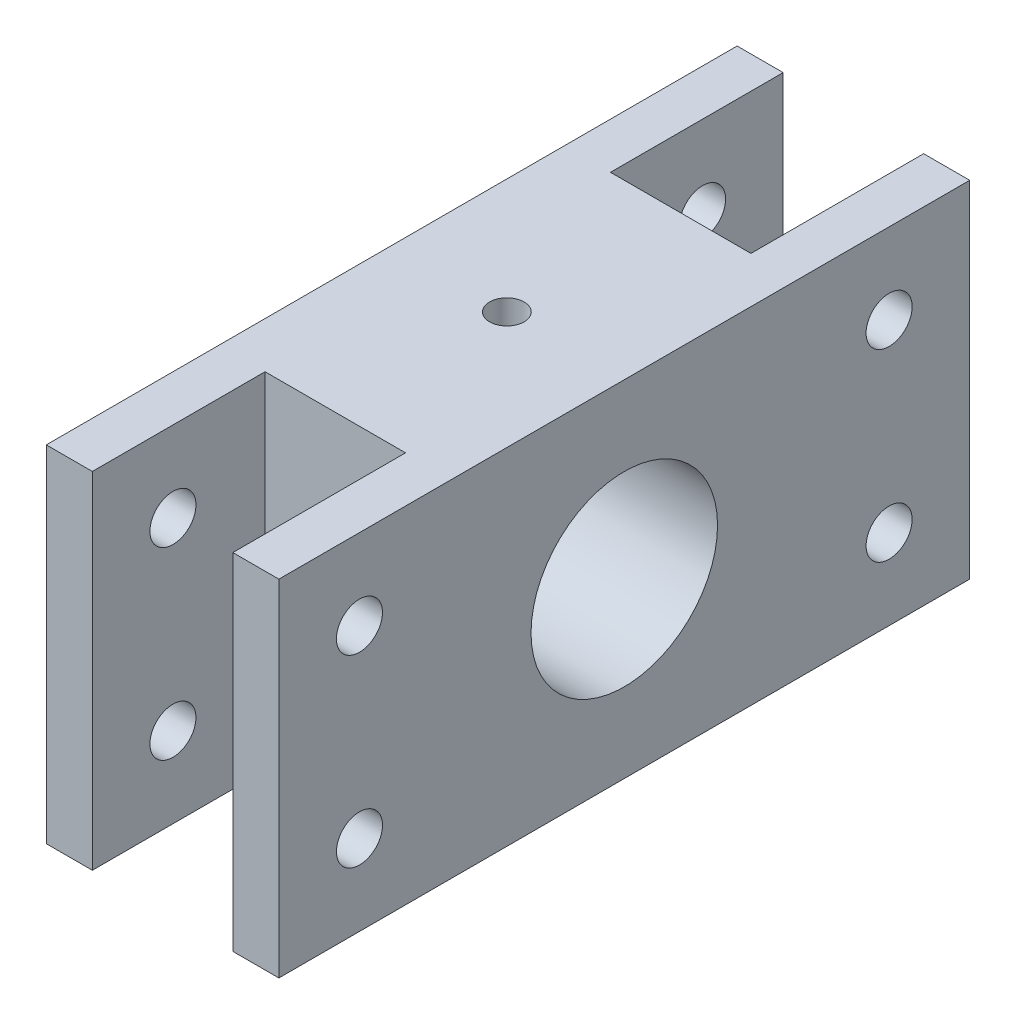
ISO-10303-21;
HEADER;
FILE_DESCRIPTION(('STEP AP214'),'2;1');
FILE_NAME('part.step','',(''),(''),'','','');
FILE_SCHEMA(('AUTOMOTIVE_DESIGN { 1 0 10303 214 1 1 1 1 }'));
ENDSEC;
DATA;
#1=APPLICATION_CONTEXT('core data for automotive mechanical design processes');
#2=APPLICATION_PROTOCOL_DEFINITION('international standard','automotive_design',2000,#1);
#3=PRODUCT_CONTEXT('',#1,'mechanical');
#4=PRODUCT('Part','Part','',(#3));
#5=PRODUCT_RELATED_PRODUCT_CATEGORY('part','',(#4));
#6=PRODUCT_DEFINITION_FORMATION('','',#4);
#7=PRODUCT_DEFINITION_CONTEXT('part definition',#1,'design');
#8=PRODUCT_DEFINITION('design','',#6,#7);
#9=PRODUCT_DEFINITION_SHAPE('','',#8);
#10=(LENGTH_UNIT() NAMED_UNIT(*) SI_UNIT(.MILLI.,.METRE.));
#11=(NAMED_UNIT(*) PLANE_ANGLE_UNIT() SI_UNIT($,.RADIAN.));
#12=(NAMED_UNIT(*) SI_UNIT($,.STERADIAN.) SOLID_ANGLE_UNIT());
#13=UNCERTAINTY_MEASURE_WITH_UNIT(LENGTH_MEASURE(1.E-05),#10,'distance_accuracy_value','');
#14=(GEOMETRIC_REPRESENTATION_CONTEXT(3) GLOBAL_UNCERTAINTY_ASSIGNED_CONTEXT((#13)) GLOBAL_UNIT_ASSIGNED_CONTEXT((#10,
#11,#12)) REPRESENTATION_CONTEXT('',''));
#15=CARTESIAN_POINT('',(0.,0.,0.));
#16=DIRECTION('',(0.,0.,1.));
#17=DIRECTION('',(1.,0.,0.));
#18=AXIS2_PLACEMENT_3D('',#15,#16,#17);
#19=CARTESIAN_POINT('',(20.2,15.,-30.));
#20=DIRECTION('',(0.,0.,1.));
#21=DIRECTION('',(0.,-1.,0.));
#22=AXIS2_PLACEMENT_3D('',#19,#20,#21);
#23=PLANE('',#22);
#24=DIRECTION('',(-1.,0.,0.));
#25=VECTOR('',#24,1.);
#26=CARTESIAN_POINT('',(20.2,-15.,-30.));
#27=LINE('',#26,#25);
#28=CARTESIAN_POINT('',(20.2,-15.,-30.));
#29=VERTEX_POINT('',#28);
#30=CARTESIAN_POINT('',(16.2,-15.,-30.));
#31=VERTEX_POINT('',#30);
#32=EDGE_CURVE('E149',#29,#31,#27,.T.);
#33=ORIENTED_EDGE('',*,*,#32,.T.);
#34=DIRECTION('',(0.,1.,0.));
#35=VECTOR('',#34,1.);
#36=CARTESIAN_POINT('',(16.2,-15.,-30.));
#37=LINE('',#36,#35);
#38=CARTESIAN_POINT('',(16.2,15.,-30.));
#39=VERTEX_POINT('',#38);
#40=EDGE_CURVE('E170',#31,#39,#37,.T.);
#41=ORIENTED_EDGE('',*,*,#40,.T.);
#42=DIRECTION('',(-1.,0.,0.));
#43=VECTOR('',#42,1.);
#44=CARTESIAN_POINT('',(20.2,15.,-30.));
#45=LINE('',#44,#43);
#46=CARTESIAN_POINT('',(20.2,15.,-30.));
#47=VERTEX_POINT('',#46);
#48=EDGE_CURVE('E11',#47,#39,#45,.T.);
#49=ORIENTED_EDGE('',*,*,#48,.F.);
#50=DIRECTION('',(0.,1.,0.));
#51=VECTOR('',#50,1.);
#52=CARTESIAN_POINT('',(20.2,15.,-30.));
#53=LINE('',#52,#51);
#54=EDGE_CURVE('E312',#29,#47,#53,.T.);
#55=ORIENTED_EDGE('',*,*,#54,.F.);
#56=EDGE_LOOP('',(#33,#41,#49,#55));
#57=FACE_BOUND('',#56,.T.);
#58=ADVANCED_FACE('F32',(#57),#23,.F.);
#59=CARTESIAN_POINT('',(20.2,15.,30.));
#60=DIRECTION('',(0.,0.,-1.));
#61=DIRECTION('',(0.,1.,0.));
#62=AXIS2_PLACEMENT_3D('',#59,#60,#61);
#63=PLANE('',#62);
#64=DIRECTION('',(-1.,0.,0.));
#65=VECTOR('',#64,1.);
#66=CARTESIAN_POINT('',(20.2,-15.,30.));
#67=LINE('',#66,#65);
#68=CARTESIAN_POINT('',(4.00000000000002,-15.,30.));
#69=VERTEX_POINT('',#68);
#70=CARTESIAN_POINT('',(0.,-15.,30.));
#71=VERTEX_POINT('',#70);
#72=EDGE_CURVE('E153',#69,#71,#67,.T.);
#73=ORIENTED_EDGE('',*,*,#72,.F.);
#74=DIRECTION('',(0.,1.,0.));
#75=VECTOR('',#74,1.);
#76=CARTESIAN_POINT('',(4.00000000000002,-15.,30.));
#77=LINE('',#76,#75);
#78=CARTESIAN_POINT('',(4.00000000000002,15.,30.));
#79=VERTEX_POINT('',#78);
#80=EDGE_CURVE('E270',#69,#79,#77,.T.);
#81=ORIENTED_EDGE('',*,*,#80,.T.);
#82=DIRECTION('',(-1.,0.,0.));
#83=VECTOR('',#82,1.);
#84=CARTESIAN_POINT('',(20.2,15.,30.));
#85=LINE('',#84,#83);
#86=CARTESIAN_POINT('',(0.,15.,30.));
#87=VERTEX_POINT('',#86);
#88=EDGE_CURVE('E162',#79,#87,#85,.T.);
#89=ORIENTED_EDGE('',*,*,#88,.T.);
#90=DIRECTION('',(0.,-1.,0.));
#91=VECTOR('',#90,1.);
#92=CARTESIAN_POINT('',(0.,15.,30.));
#93=LINE('',#92,#91);
#94=EDGE_CURVE('E319',#87,#71,#93,.T.);
#95=ORIENTED_EDGE('',*,*,#94,.T.);
#96=EDGE_LOOP('',(#73,#81,#89,#95));
#97=FACE_BOUND('',#96,.T.);
#98=ADVANCED_FACE('F204',(#97),#63,.F.);
#99=CARTESIAN_POINT('',(20.2,8.,23.));
#100=DIRECTION('',(-1.,0.,0.));
#101=DIRECTION('',(0.,0.,1.));
#102=AXIS2_PLACEMENT_3D('',#99,#100,#101);
#103=CYLINDRICAL_SURFACE('',#102,2.);
#104=CARTESIAN_POINT('',(4.00000000000001,8.,23.));
#105=DIRECTION('',(-1.,0.,0.));
#106=DIRECTION('',(0.,0.,1.));
#107=AXIS2_PLACEMENT_3D('',#104,#105,#106);
#108=CIRCLE('',#107,2.);
#109=CARTESIAN_POINT('',(4.00000000000002,8.,25.));
#110=VERTEX_POINT('',#109);
#111=EDGE_CURVE('E181',#110,#110,#108,.T.);
#112=ORIENTED_EDGE('',*,*,#111,.F.);
#113=EDGE_LOOP('',(#112));
#114=FACE_BOUND('',#113,.T.);
#115=CARTESIAN_POINT('',(0.,8.,23.));
#116=DIRECTION('',(1.,0.,0.));
#117=DIRECTION('',(0.,0.,-1.));
#118=AXIS2_PLACEMENT_3D('',#115,#116,#117);
#119=CIRCLE('',#118,2.);
#120=CARTESIAN_POINT('',(0.,8.,21.));
#121=VERTEX_POINT('',#120);
#122=EDGE_CURVE('E303',#121,#121,#119,.T.);
#123=ORIENTED_EDGE('',*,*,#122,.F.);
#124=EDGE_LOOP('',(#123));
#125=FACE_BOUND('',#124,.T.);
#126=ADVANCED_FACE('F209',(#114,#125),#103,.F.);
#127=CARTESIAN_POINT('',(20.2,-8.,23.));
#128=DIRECTION('',(-1.,0.,0.));
#129=DIRECTION('',(0.,0.,1.));
#130=AXIS2_PLACEMENT_3D('',#127,#128,#129);
#131=CYLINDRICAL_SURFACE('',#130,2.);
#132=CARTESIAN_POINT('',(4.00000000000001,-8.,23.));
#133=DIRECTION('',(-1.,0.,0.));
#134=DIRECTION('',(0.,0.,1.));
#135=AXIS2_PLACEMENT_3D('',#132,#133,#134);
#136=CIRCLE('',#135,2.);
#137=CARTESIAN_POINT('',(4.00000000000002,-8.,25.));
#138=VERTEX_POINT('',#137);
#139=EDGE_CURVE('E179',#138,#138,#136,.T.);
#140=ORIENTED_EDGE('',*,*,#139,.F.);
#141=EDGE_LOOP('',(#140));
#142=FACE_BOUND('',#141,.T.);
#143=CARTESIAN_POINT('',(0.,-8.,23.));
#144=DIRECTION('',(1.,0.,0.));
#145=DIRECTION('',(0.,0.,1.));
#146=AXIS2_PLACEMENT_3D('',#143,#144,#145);
#147=CIRCLE('',#146,2.);
#148=CARTESIAN_POINT('',(0.,-8.,25.));
#149=VERTEX_POINT('',#148);
#150=EDGE_CURVE('E297',#149,#149,#147,.T.);
#151=ORIENTED_EDGE('',*,*,#150,.F.);
#152=EDGE_LOOP('',(#151));
#153=FACE_BOUND('',#152,.T.);
#154=ADVANCED_FACE('F389',(#142,#153),#131,.F.);
#155=CARTESIAN_POINT('',(20.2,-8.,-23.));
#156=DIRECTION('',(-1.,0.,0.));
#157=DIRECTION('',(0.,0.,1.));
#158=AXIS2_PLACEMENT_3D('',#155,#156,#157);
#159=CYLINDRICAL_SURFACE('',#158,2.);
#160=CARTESIAN_POINT('',(16.2,-8.,-23.));
#161=DIRECTION('',(1.,0.,0.));
#162=DIRECTION('',(0.,0.,-1.));
#163=AXIS2_PLACEMENT_3D('',#160,#161,#162);
#164=CIRCLE('',#163,2.);
#165=CARTESIAN_POINT('',(16.2,-8.,-25.));
#166=VERTEX_POINT('',#165);
#167=EDGE_CURVE('E174',#166,#166,#164,.T.);
#168=ORIENTED_EDGE('',*,*,#167,.F.);
#169=EDGE_LOOP('',(#168));
#170=FACE_BOUND('',#169,.T.);
#171=CARTESIAN_POINT('',(20.2,-8.,-23.));
#172=DIRECTION('',(1.,0.,0.));
#173=DIRECTION('',(0.,0.,-1.));
#174=AXIS2_PLACEMENT_3D('',#171,#172,#173);
#175=CIRCLE('',#174,2.);
#176=CARTESIAN_POINT('',(20.2,-8.,-25.));
#177=VERTEX_POINT('',#176);
#178=EDGE_CURVE('E294',#177,#177,#175,.T.);
#179=ORIENTED_EDGE('',*,*,#178,.T.);
#180=EDGE_LOOP('',(#179));
#181=FACE_BOUND('',#180,.T.);
#182=ADVANCED_FACE('F386',(#170,#181),#159,.F.);
#183=CARTESIAN_POINT('',(20.2,8.,-23.));
#184=DIRECTION('',(-1.,0.,0.));
#185=DIRECTION('',(0.,0.,1.));
#186=AXIS2_PLACEMENT_3D('',#183,#184,#185);
#187=CYLINDRICAL_SURFACE('',#186,2.);
#188=CARTESIAN_POINT('',(16.2,8.,-23.));
#189=DIRECTION('',(1.,0.,0.));
#190=DIRECTION('',(0.,0.,-1.));
#191=AXIS2_PLACEMENT_3D('',#188,#189,#190);
#192=CIRCLE('',#191,2.);
#193=CARTESIAN_POINT('',(16.2,8.,-25.));
#194=VERTEX_POINT('',#193);
#195=EDGE_CURVE('E171',#194,#194,#192,.T.);
#196=ORIENTED_EDGE('',*,*,#195,.F.);
#197=EDGE_LOOP('',(#196));
#198=FACE_BOUND('',#197,.T.);
#199=CARTESIAN_POINT('',(20.2,8.,-23.));
#200=DIRECTION('',(1.,0.,0.));
#201=DIRECTION('',(0.,0.,1.));
#202=AXIS2_PLACEMENT_3D('',#199,#200,#201);
#203=CIRCLE('',#202,2.);
#204=CARTESIAN_POINT('',(20.2,8.,-21.));
#205=VERTEX_POINT('',#204);
#206=EDGE_CURVE('E288',#205,#205,#203,.T.);
#207=ORIENTED_EDGE('',*,*,#206,.T.);
#208=EDGE_LOOP('',(#207));
#209=FACE_BOUND('',#208,.T.);
#210=ADVANCED_FACE('F227',(#198,#209),#187,.F.);
#211=CARTESIAN_POINT('',(20.2,0.,0.));
#212=DIRECTION('',(1.,0.,0.));
#213=DIRECTION('',(0.,0.,-1.));
#214=AXIS2_PLACEMENT_3D('',#211,#212,#213);
#215=PLANE('',#214);
#216=CARTESIAN_POINT('',(20.2,0.,0.));
#217=DIRECTION('',(-1.,0.,0.));
#218=DIRECTION('',(0.,0.,1.));
#219=AXIS2_PLACEMENT_3D('',#216,#217,#218);
#220=CIRCLE('',#219,8.1);
#221=CARTESIAN_POINT('',(20.2,0.,8.1));
#222=VERTEX_POINT('',#221);
#223=EDGE_CURVE('E257',#222,#222,#220,.T.);
#224=ORIENTED_EDGE('',*,*,#223,.T.);
#225=EDGE_LOOP('',(#224));
#226=FACE_BOUND('',#225,.T.);
#227=ORIENTED_EDGE('',*,*,#178,.F.);
#228=EDGE_LOOP('',(#227));
#229=FACE_BOUND('',#228,.T.);
#230=CARTESIAN_POINT('',(20.2,8.,23.));
#231=DIRECTION('',(1.,0.,0.));
#232=DIRECTION('',(0.,0.,-1.));
#233=AXIS2_PLACEMENT_3D('',#230,#231,#232);
#234=CIRCLE('',#233,2.);
#235=CARTESIAN_POINT('',(20.2,8.,21.));
#236=VERTEX_POINT('',#235);
#237=EDGE_CURVE('E306',#236,#236,#234,.T.);
#238=ORIENTED_EDGE('',*,*,#237,.F.);
#239=EDGE_LOOP('',(#238));
#240=FACE_BOUND('',#239,.T.);
#241=ORIENTED_EDGE('',*,*,#54,.T.);
#242=DIRECTION('',(0.,0.,1.));
#243=VECTOR('',#242,1.);
#244=CARTESIAN_POINT('',(20.2,15.,30.));
#245=LINE('',#244,#243);
#246=CARTESIAN_POINT('',(20.2,15.,30.));
#247=VERTEX_POINT('',#246);
#248=EDGE_CURVE('E248',#47,#247,#245,.T.);
#249=ORIENTED_EDGE('',*,*,#248,.T.);
#250=DIRECTION('',(0.,-1.,0.));
#251=VECTOR('',#250,1.);
#252=CARTESIAN_POINT('',(20.2,15.,30.));
#253=LINE('',#252,#251);
#254=CARTESIAN_POINT('',(20.2,-15.,30.));
#255=VERTEX_POINT('',#254);
#256=EDGE_CURVE('E154',#247,#255,#253,.T.);
#257=ORIENTED_EDGE('',*,*,#256,.T.);
#258=DIRECTION('',(0.,0.,-1.));
#259=VECTOR('',#258,1.);
#260=CARTESIAN_POINT('',(20.2,-15.,30.));
#261=LINE('',#260,#259);
#262=EDGE_CURVE('E150',#255,#29,#261,.T.);
#263=ORIENTED_EDGE('',*,*,#262,.T.);
#264=EDGE_LOOP('',(#241,#249,#257,#263));
#265=FACE_BOUND('',#264,.T.);
#266=CARTESIAN_POINT('',(20.2,-8.,23.));
#267=DIRECTION('',(1.,0.,0.));
#268=DIRECTION('',(0.,0.,1.));
#269=AXIS2_PLACEMENT_3D('',#266,#267,#268);
#270=CIRCLE('',#269,2.);
#271=CARTESIAN_POINT('',(20.2,-8.,25.));
#272=VERTEX_POINT('',#271);
#273=EDGE_CURVE('E300',#272,#272,#270,.T.);
#274=ORIENTED_EDGE('',*,*,#273,.F.);
#275=EDGE_LOOP('',(#274));
#276=FACE_BOUND('',#275,.T.);
#277=ORIENTED_EDGE('',*,*,#206,.F.);
#278=EDGE_LOOP('',(#277));
#279=FACE_BOUND('',#278,.T.);
#280=ADVANCED_FACE('F221',(#226,#229,#240,#265,#276,#279),#215,.T.);
#281=CARTESIAN_POINT('',(0.,0.,0.));
#282=DIRECTION('',(1.,0.,0.));
#283=DIRECTION('',(0.,0.,-1.));
#284=AXIS2_PLACEMENT_3D('',#281,#282,#283);
#285=PLANE('',#284);
#286=CARTESIAN_POINT('',(0.,0.,0.));
#287=DIRECTION('',(-1.,0.,0.));
#288=DIRECTION('',(0.,0.,1.));
#289=AXIS2_PLACEMENT_3D('',#286,#287,#288);
#290=CIRCLE('',#289,8.1);
#291=CARTESIAN_POINT('',(0.,0.,8.1));
#292=VERTEX_POINT('',#291);
#293=EDGE_CURVE('E262',#292,#292,#290,.T.);
#294=ORIENTED_EDGE('',*,*,#293,.F.);
#295=EDGE_LOOP('',(#294));
#296=FACE_BOUND('',#295,.T.);
#297=DIRECTION('',(0.,1.,0.));
#298=VECTOR('',#297,1.);
#299=CARTESIAN_POINT('',(0.,15.,-30.));
#300=LINE('',#299,#298);
#301=CARTESIAN_POINT('',(0.,-15.,-30.));
#302=VERTEX_POINT('',#301);
#303=CARTESIAN_POINT('',(0.,15.,-30.));
#304=VERTEX_POINT('',#303);
#305=EDGE_CURVE('E309',#302,#304,#300,.T.);
#306=ORIENTED_EDGE('',*,*,#305,.F.);
#307=DIRECTION('',(0.,0.,-1.));
#308=VECTOR('',#307,1.);
#309=CARTESIAN_POINT('',(0.,-15.,30.));
#310=LINE('',#309,#308);
#311=EDGE_CURVE('E147',#71,#302,#310,.T.);
#312=ORIENTED_EDGE('',*,*,#311,.F.);
#313=ORIENTED_EDGE('',*,*,#94,.F.);
#314=DIRECTION('',(0.,0.,1.));
#315=VECTOR('',#314,1.);
#316=CARTESIAN_POINT('',(0.,15.,30.));
#317=LINE('',#316,#315);
#318=EDGE_CURVE('E317',#304,#87,#317,.T.);
#319=ORIENTED_EDGE('',*,*,#318,.F.);
#320=EDGE_LOOP('',(#306,#312,#313,#319));
#321=FACE_BOUND('',#320,.T.);
#322=ORIENTED_EDGE('',*,*,#122,.T.);
#323=EDGE_LOOP('',(#322));
#324=FACE_BOUND('',#323,.T.);
#325=ORIENTED_EDGE('',*,*,#150,.T.);
#326=EDGE_LOOP('',(#325));
#327=FACE_BOUND('',#326,.T.);
#328=CARTESIAN_POINT('',(0.,-8.,-23.));
#329=DIRECTION('',(1.,0.,0.));
#330=DIRECTION('',(0.,0.,-1.));
#331=AXIS2_PLACEMENT_3D('',#328,#329,#330);
#332=CIRCLE('',#331,2.);
#333=CARTESIAN_POINT('',(0.,-8.,-25.));
#334=VERTEX_POINT('',#333);
#335=EDGE_CURVE('E291',#334,#334,#332,.T.);
#336=ORIENTED_EDGE('',*,*,#335,.T.);
#337=EDGE_LOOP('',(#336));
#338=FACE_BOUND('',#337,.T.);
#339=CARTESIAN_POINT('',(0.,8.,-23.));
#340=DIRECTION('',(1.,0.,0.));
#341=DIRECTION('',(0.,0.,1.));
#342=AXIS2_PLACEMENT_3D('',#339,#340,#341);
#343=CIRCLE('',#342,2.);
#344=CARTESIAN_POINT('',(0.,8.,-21.));
#345=VERTEX_POINT('',#344);
#346=EDGE_CURVE('E287',#345,#345,#343,.T.);
#347=ORIENTED_EDGE('',*,*,#346,.T.);
#348=EDGE_LOOP('',(#347));
#349=FACE_BOUND('',#348,.T.);
#350=ADVANCED_FACE('F215',(#296,#321,#324,#327,#338,#349),#285,.F.);
#351=CARTESIAN_POINT('',(4.,15.,-30.));
#352=VERTEX_POINT('',#351);
#353=EDGE_CURVE('E46',#352,#304,#45,.T.);
#354=ORIENTED_EDGE('',*,*,#353,.F.);
#355=DIRECTION('',(0.,1.,0.));
#356=VECTOR('',#355,1.);
#357=CARTESIAN_POINT('',(4.,-15.,-30.));
#358=LINE('',#357,#356);
#359=CARTESIAN_POINT('',(4.,-15.,-30.));
#360=VERTEX_POINT('',#359);
#361=EDGE_CURVE('E131',#360,#352,#358,.T.);
#362=ORIENTED_EDGE('',*,*,#361,.F.);
#363=EDGE_CURVE('E141',#360,#302,#27,.T.);
#364=ORIENTED_EDGE('',*,*,#363,.T.);
#365=ORIENTED_EDGE('',*,*,#305,.T.);
#366=EDGE_LOOP('',(#354,#362,#364,#365));
#367=FACE_BOUND('',#366,.T.);
#368=ADVANCED_FACE('F34',(#367),#23,.F.);
#369=CARTESIAN_POINT('',(20.2,15.,30.));
#370=DIRECTION('',(0.,-1.,0.));
#371=DIRECTION('',(0.,0.,-1.));
#372=AXIS2_PLACEMENT_3D('',#369,#370,#371);
#373=PLANE('',#372);
#374=CARTESIAN_POINT('',(10.,15.,0.));
#375=DIRECTION('',(0.,1.,0.));
#376=DIRECTION('',(0.,0.,1.));
#377=AXIS2_PLACEMENT_3D('',#374,#375,#376);
#378=CIRCLE('',#377,1.5);
#379=CARTESIAN_POINT('',(10.,15.,1.5));
#380=VERTEX_POINT('',#379);
#381=EDGE_CURVE('E577',#380,#380,#378,.T.);
#382=ORIENTED_EDGE('',*,*,#381,.F.);
#383=EDGE_LOOP('',(#382));
#384=FACE_BOUND('',#383,.T.);
#385=ORIENTED_EDGE('',*,*,#48,.T.);
#386=DIRECTION('',(0.,0.,-1.));
#387=VECTOR('',#386,1.);
#388=CARTESIAN_POINT('',(16.2,15.,-30.));
#389=LINE('',#388,#387);
#390=CARTESIAN_POINT('',(16.2,15.,-15.));
#391=VERTEX_POINT('',#390);
#392=EDGE_CURVE('E136',#391,#39,#389,.T.);
#393=ORIENTED_EDGE('',*,*,#392,.F.);
#394=DIRECTION('',(1.,0.,0.));
#395=VECTOR('',#394,1.);
#396=CARTESIAN_POINT('',(4.,15.,-15.));
#397=LINE('',#396,#395);
#398=CARTESIAN_POINT('',(4.,15.,-15.));
#399=VERTEX_POINT('',#398);
#400=EDGE_CURVE('E329',#399,#391,#397,.T.);
#401=ORIENTED_EDGE('',*,*,#400,.F.);
#402=DIRECTION('',(0.,0.,1.));
#403=VECTOR('',#402,1.);
#404=CARTESIAN_POINT('',(4.,15.,-30.));
#405=LINE('',#404,#403);
#406=EDGE_CURVE('E273',#352,#399,#405,.T.);
#407=ORIENTED_EDGE('',*,*,#406,.F.);
#408=ORIENTED_EDGE('',*,*,#353,.T.);
#409=ORIENTED_EDGE('',*,*,#318,.T.);
#410=ORIENTED_EDGE('',*,*,#88,.F.);
#411=DIRECTION('',(0.,0.,1.));
#412=VECTOR('',#411,1.);
#413=CARTESIAN_POINT('',(4.00000000000002,15.,30.));
#414=LINE('',#413,#412);
#415=CARTESIAN_POINT('',(4.00000000000001,15.,15.));
#416=VERTEX_POINT('',#415);
#417=EDGE_CURVE('E259',#416,#79,#414,.T.);
#418=ORIENTED_EDGE('',*,*,#417,.F.);
#419=DIRECTION('',(-1.,0.,0.));
#420=VECTOR('',#419,1.);
#421=CARTESIAN_POINT('',(4.00000000000001,15.,15.));
#422=LINE('',#421,#420);
#423=CARTESIAN_POINT('',(16.2,15.,15.));
#424=VERTEX_POINT('',#423);
#425=EDGE_CURVE('E255',#424,#416,#422,.T.);
#426=ORIENTED_EDGE('',*,*,#425,.F.);
#427=DIRECTION('',(0.,0.,-1.));
#428=VECTOR('',#427,1.);
#429=CARTESIAN_POINT('',(16.2,15.,30.));
#430=LINE('',#429,#428);
#431=CARTESIAN_POINT('',(16.2,15.,30.));
#432=VERTEX_POINT('',#431);
#433=EDGE_CURVE('E252',#432,#424,#430,.T.);
#434=ORIENTED_EDGE('',*,*,#433,.F.);
#435=EDGE_CURVE('E163',#247,#432,#85,.T.);
#436=ORIENTED_EDGE('',*,*,#435,.F.);
#437=ORIENTED_EDGE('',*,*,#248,.F.);
#438=EDGE_LOOP('',(#385,#393,#401,#407,#408,#409,#410,#418,#426,#434,#436,#437));
#439=FACE_BOUND('',#438,.T.);
#440=ADVANCED_FACE('F214',(#384,#439),#373,.F.);
#441=ORIENTED_EDGE('',*,*,#435,.T.);
#442=DIRECTION('',(0.,1.,0.));
#443=VECTOR('',#442,1.);
#444=CARTESIAN_POINT('',(16.2,-15.,30.));
#445=LINE('',#444,#443);
#446=CARTESIAN_POINT('',(16.2,-15.,30.));
#447=VERTEX_POINT('',#446);
#448=EDGE_CURVE('E245',#447,#432,#445,.T.);
#449=ORIENTED_EDGE('',*,*,#448,.F.);
#450=EDGE_CURVE('E159',#255,#447,#67,.T.);
#451=ORIENTED_EDGE('',*,*,#450,.F.);
#452=ORIENTED_EDGE('',*,*,#256,.F.);
#453=EDGE_LOOP('',(#441,#449,#451,#452));
#454=FACE_BOUND('',#453,.T.);
#455=ADVANCED_FACE('F212',(#454),#63,.F.);
#456=CARTESIAN_POINT('',(20.2,-15.,30.));
#457=DIRECTION('',(0.,1.,0.));
#458=DIRECTION('',(0.,0.,1.));
#459=AXIS2_PLACEMENT_3D('',#456,#457,#458);
#460=PLANE('',#459);
#461=CARTESIAN_POINT('',(10.,-15.,0.));
#462=DIRECTION('',(0.,1.,0.));
#463=DIRECTION('',(0.,0.,1.));
#464=AXIS2_PLACEMENT_3D('',#461,#462,#463);
#465=CIRCLE('',#464,1.5);
#466=CARTESIAN_POINT('',(10.,-15.,1.5));
#467=VERTEX_POINT('',#466);
#468=EDGE_CURVE('E187',#467,#467,#465,.T.);
#469=ORIENTED_EDGE('',*,*,#468,.T.);
#470=EDGE_LOOP('',(#469));
#471=FACE_BOUND('',#470,.T.);
#472=DIRECTION('',(1.,0.,0.));
#473=VECTOR('',#472,1.);
#474=CARTESIAN_POINT('',(4.,-15.,-15.));
#475=LINE('',#474,#473);
#476=CARTESIAN_POINT('',(4.,-15.,-15.));
#477=VERTEX_POINT('',#476);
#478=CARTESIAN_POINT('',(16.2,-15.,-15.));
#479=VERTEX_POINT('',#478);
#480=EDGE_CURVE('E54',#477,#479,#475,.T.);
#481=ORIENTED_EDGE('',*,*,#480,.T.);
#482=DIRECTION('',(0.,0.,-1.));
#483=VECTOR('',#482,1.);
#484=CARTESIAN_POINT('',(16.2,-15.,-30.));
#485=LINE('',#484,#483);
#486=EDGE_CURVE('E143',#479,#31,#485,.T.);
#487=ORIENTED_EDGE('',*,*,#486,.T.);
#488=ORIENTED_EDGE('',*,*,#32,.F.);
#489=ORIENTED_EDGE('',*,*,#262,.F.);
#490=ORIENTED_EDGE('',*,*,#450,.T.);
#491=DIRECTION('',(0.,0.,-1.));
#492=VECTOR('',#491,1.);
#493=CARTESIAN_POINT('',(16.2,-15.,30.));
#494=LINE('',#493,#492);
#495=CARTESIAN_POINT('',(16.2,-15.,15.));
#496=VERTEX_POINT('',#495);
#497=EDGE_CURVE('E269',#447,#496,#494,.T.);
#498=ORIENTED_EDGE('',*,*,#497,.T.);
#499=DIRECTION('',(-1.,0.,0.));
#500=VECTOR('',#499,1.);
#501=CARTESIAN_POINT('',(4.00000000000001,-15.,15.));
#502=LINE('',#501,#500);
#503=CARTESIAN_POINT('',(4.00000000000001,-15.,15.));
#504=VERTEX_POINT('',#503);
#505=EDGE_CURVE('E62',#496,#504,#502,.T.);
#506=ORIENTED_EDGE('',*,*,#505,.T.);
#507=DIRECTION('',(0.,0.,1.));
#508=VECTOR('',#507,1.);
#509=CARTESIAN_POINT('',(4.00000000000002,-15.,30.));
#510=LINE('',#509,#508);
#511=EDGE_CURVE('E265',#504,#69,#510,.T.);
#512=ORIENTED_EDGE('',*,*,#511,.T.);
#513=ORIENTED_EDGE('',*,*,#72,.T.);
#514=ORIENTED_EDGE('',*,*,#311,.T.);
#515=ORIENTED_EDGE('',*,*,#363,.F.);
#516=DIRECTION('',(0.,0.,1.));
#517=VECTOR('',#516,1.);
#518=CARTESIAN_POINT('',(4.,-15.,-30.));
#519=LINE('',#518,#517);
#520=EDGE_CURVE('E127',#360,#477,#519,.T.);
#521=ORIENTED_EDGE('',*,*,#520,.T.);
#522=EDGE_LOOP('',(#481,#487,#488,#489,#490,#498,#506,#512,#513,#514,#515,#521));
#523=FACE_BOUND('',#522,.T.);
#524=ADVANCED_FACE('F145',(#471,#523),#460,.F.);
#525=CARTESIAN_POINT('',(16.2,8.,23.));
#526=DIRECTION('',(1.,0.,0.));
#527=DIRECTION('',(0.,0.,-1.));
#528=AXIS2_PLACEMENT_3D('',#525,#526,#527);
#529=CIRCLE('',#528,2.);
#530=CARTESIAN_POINT('',(16.2,8.,21.));
#531=VERTEX_POINT('',#530);
#532=EDGE_CURVE('E178',#531,#531,#529,.T.);
#533=ORIENTED_EDGE('',*,*,#532,.F.);
#534=EDGE_LOOP('',(#533));
#535=FACE_BOUND('',#534,.T.);
#536=ORIENTED_EDGE('',*,*,#237,.T.);
#537=EDGE_LOOP('',(#536));
#538=FACE_BOUND('',#537,.T.);
#539=ADVANCED_FACE('F235',(#535,#538),#103,.F.);
#540=CARTESIAN_POINT('',(16.2,-8.,23.));
#541=DIRECTION('',(1.,0.,0.));
#542=DIRECTION('',(0.,0.,-1.));
#543=AXIS2_PLACEMENT_3D('',#540,#541,#542);
#544=CIRCLE('',#543,2.);
#545=CARTESIAN_POINT('',(16.2,-8.,21.));
#546=VERTEX_POINT('',#545);
#547=EDGE_CURVE('E175',#546,#546,#544,.T.);
#548=ORIENTED_EDGE('',*,*,#547,.F.);
#549=EDGE_LOOP('',(#548));
#550=FACE_BOUND('',#549,.T.);
#551=ORIENTED_EDGE('',*,*,#273,.T.);
#552=EDGE_LOOP('',(#551));
#553=FACE_BOUND('',#552,.T.);
#554=ADVANCED_FACE('F384',(#550,#553),#131,.F.);
#555=CARTESIAN_POINT('',(4.,-8.,-23.));
#556=DIRECTION('',(-1.,0.,0.));
#557=DIRECTION('',(0.,0.,1.));
#558=AXIS2_PLACEMENT_3D('',#555,#556,#557);
#559=CIRCLE('',#558,2.);
#560=CARTESIAN_POINT('',(4.,-8.,-21.));
#561=VERTEX_POINT('',#560);
#562=EDGE_CURVE('E169',#561,#561,#559,.T.);
#563=ORIENTED_EDGE('',*,*,#562,.F.);
#564=EDGE_LOOP('',(#563));
#565=FACE_BOUND('',#564,.T.);
#566=ORIENTED_EDGE('',*,*,#335,.F.);
#567=EDGE_LOOP('',(#566));
#568=FACE_BOUND('',#567,.T.);
#569=ADVANCED_FACE('F380',(#565,#568),#159,.F.);
#570=CARTESIAN_POINT('',(4.,8.,-23.));
#571=DIRECTION('',(-1.,0.,0.));
#572=DIRECTION('',(0.,0.,1.));
#573=AXIS2_PLACEMENT_3D('',#570,#571,#572);
#574=CIRCLE('',#573,2.);
#575=CARTESIAN_POINT('',(4.,8.,-21.));
#576=VERTEX_POINT('',#575);
#577=EDGE_CURVE('E166',#576,#576,#574,.T.);
#578=ORIENTED_EDGE('',*,*,#577,.F.);
#579=EDGE_LOOP('',(#578));
#580=FACE_BOUND('',#579,.T.);
#581=ORIENTED_EDGE('',*,*,#346,.F.);
#582=EDGE_LOOP('',(#581));
#583=FACE_BOUND('',#582,.T.);
#584=ADVANCED_FACE('F367',(#580,#583),#187,.F.);
#585=CARTESIAN_POINT('',(16.2,-15.,-30.));
#586=DIRECTION('',(1.,0.,0.));
#587=DIRECTION('',(0.,0.,-1.));
#588=AXIS2_PLACEMENT_3D('',#585,#586,#587);
#589=PLANE('',#588);
#590=ORIENTED_EDGE('',*,*,#167,.T.);
#591=EDGE_LOOP('',(#590));
#592=FACE_BOUND('',#591,.T.);
#593=ORIENTED_EDGE('',*,*,#195,.T.);
#594=EDGE_LOOP('',(#593));
#595=FACE_BOUND('',#594,.T.);
#596=ORIENTED_EDGE('',*,*,#392,.T.);
#597=ORIENTED_EDGE('',*,*,#40,.F.);
#598=ORIENTED_EDGE('',*,*,#486,.F.);
#599=DIRECTION('',(0.,1.,0.));
#600=VECTOR('',#599,1.);
#601=CARTESIAN_POINT('',(16.2,-15.,-15.));
#602=LINE('',#601,#600);
#603=EDGE_CURVE('E338',#479,#391,#602,.T.);
#604=ORIENTED_EDGE('',*,*,#603,.T.);
#605=EDGE_LOOP('',(#596,#597,#598,#604));
#606=FACE_BOUND('',#605,.T.);
#607=ADVANCED_FACE('F356',(#592,#595,#606),#589,.F.);
#608=CARTESIAN_POINT('',(4.,-15.,-15.));
#609=DIRECTION('',(0.,0.,1.));
#610=DIRECTION('',(1.,0.,0.));
#611=AXIS2_PLACEMENT_3D('',#608,#609,#610);
#612=PLANE('',#611);
#613=ORIENTED_EDGE('',*,*,#400,.T.);
#614=ORIENTED_EDGE('',*,*,#603,.F.);
#615=ORIENTED_EDGE('',*,*,#480,.F.);
#616=DIRECTION('',(0.,1.,0.));
#617=VECTOR('',#616,1.);
#618=CARTESIAN_POINT('',(4.,-15.,-15.));
#619=LINE('',#618,#617);
#620=EDGE_CURVE('E133',#477,#399,#619,.T.);
#621=ORIENTED_EDGE('',*,*,#620,.T.);
#622=EDGE_LOOP('',(#613,#614,#615,#621));
#623=FACE_BOUND('',#622,.T.);
#624=ADVANCED_FACE('F358',(#623),#612,.F.);
#625=CARTESIAN_POINT('',(4.,-15.,-30.));
#626=DIRECTION('',(-1.,0.,0.));
#627=DIRECTION('',(0.,0.,1.));
#628=AXIS2_PLACEMENT_3D('',#625,#626,#627);
#629=PLANE('',#628);
#630=ORIENTED_EDGE('',*,*,#562,.T.);
#631=EDGE_LOOP('',(#630));
#632=FACE_BOUND('',#631,.T.);
#633=ORIENTED_EDGE('',*,*,#577,.T.);
#634=EDGE_LOOP('',(#633));
#635=FACE_BOUND('',#634,.T.);
#636=ORIENTED_EDGE('',*,*,#406,.T.);
#637=ORIENTED_EDGE('',*,*,#620,.F.);
#638=ORIENTED_EDGE('',*,*,#520,.F.);
#639=ORIENTED_EDGE('',*,*,#361,.T.);
#640=EDGE_LOOP('',(#636,#637,#638,#639));
#641=FACE_BOUND('',#640,.T.);
#642=ADVANCED_FACE('F130',(#632,#635,#641),#629,.F.);
#643=CARTESIAN_POINT('',(4.00000000000002,-15.,30.));
#644=DIRECTION('',(-1.,0.,0.));
#645=DIRECTION('',(0.,0.,1.));
#646=AXIS2_PLACEMENT_3D('',#643,#644,#645);
#647=PLANE('',#646);
#648=ORIENTED_EDGE('',*,*,#111,.T.);
#649=EDGE_LOOP('',(#648));
#650=FACE_BOUND('',#649,.T.);
#651=ORIENTED_EDGE('',*,*,#139,.T.);
#652=EDGE_LOOP('',(#651));
#653=FACE_BOUND('',#652,.T.);
#654=ORIENTED_EDGE('',*,*,#417,.T.);
#655=ORIENTED_EDGE('',*,*,#80,.F.);
#656=ORIENTED_EDGE('',*,*,#511,.F.);
#657=DIRECTION('',(0.,1.,0.));
#658=VECTOR('',#657,1.);
#659=CARTESIAN_POINT('',(4.00000000000001,-15.,15.));
#660=LINE('',#659,#658);
#661=EDGE_CURVE('E274',#504,#416,#660,.T.);
#662=ORIENTED_EDGE('',*,*,#661,.T.);
#663=EDGE_LOOP('',(#654,#655,#656,#662));
#664=FACE_BOUND('',#663,.T.);
#665=ADVANCED_FACE('F345',(#650,#653,#664),#647,.F.);
#666=CARTESIAN_POINT('',(4.00000000000001,-15.,15.));
#667=DIRECTION('',(0.,0.,-1.));
#668=DIRECTION('',(-1.,0.,0.));
#669=AXIS2_PLACEMENT_3D('',#666,#667,#668);
#670=PLANE('',#669);
#671=ORIENTED_EDGE('',*,*,#425,.T.);
#672=ORIENTED_EDGE('',*,*,#661,.F.);
#673=ORIENTED_EDGE('',*,*,#505,.F.);
#674=DIRECTION('',(0.,1.,0.));
#675=VECTOR('',#674,1.);
#676=CARTESIAN_POINT('',(16.2,-15.,15.));
#677=LINE('',#676,#675);
#678=EDGE_CURVE('E276',#496,#424,#677,.T.);
#679=ORIENTED_EDGE('',*,*,#678,.T.);
#680=EDGE_LOOP('',(#671,#672,#673,#679));
#681=FACE_BOUND('',#680,.T.);
#682=ADVANCED_FACE('F346',(#681),#670,.F.);
#683=CARTESIAN_POINT('',(16.2,-15.,30.));
#684=DIRECTION('',(1.,0.,0.));
#685=DIRECTION('',(0.,0.,-1.));
#686=AXIS2_PLACEMENT_3D('',#683,#684,#685);
#687=PLANE('',#686);
#688=ORIENTED_EDGE('',*,*,#532,.T.);
#689=EDGE_LOOP('',(#688));
#690=FACE_BOUND('',#689,.T.);
#691=ORIENTED_EDGE('',*,*,#547,.T.);
#692=EDGE_LOOP('',(#691));
#693=FACE_BOUND('',#692,.T.);
#694=ORIENTED_EDGE('',*,*,#433,.T.);
#695=ORIENTED_EDGE('',*,*,#678,.F.);
#696=ORIENTED_EDGE('',*,*,#497,.F.);
#697=ORIENTED_EDGE('',*,*,#448,.T.);
#698=EDGE_LOOP('',(#694,#695,#696,#697));
#699=FACE_BOUND('',#698,.T.);
#700=ADVANCED_FACE('F347',(#690,#693,#699),#687,.F.);
#701=CARTESIAN_POINT('',(20.2,0.,0.));
#702=DIRECTION('',(-1.,0.,0.));
#703=DIRECTION('',(0.,0.,1.));
#704=AXIS2_PLACEMENT_3D('',#701,#702,#703);
#705=CYLINDRICAL_SURFACE('',#704,8.1);
#706=CARTESIAN_POINT('',(10.,-7.95989949685296,1.5));
#707=CARTESIAN_POINT('',(9.91652310228049,-7.9599011023528,1.49999677873819));
#708=CARTESIAN_POINT('',(9.83300418812543,-7.96122690930283,1.49300797015768));
#709=CARTESIAN_POINT('',(9.66832003258713,-7.96638049117453,1.46525545341296));
#710=CARTESIAN_POINT('',(9.58715687036129,-7.97021041002928,1.44447994132703));
#711=CARTESIAN_POINT('',(9.42959094255974,-7.9799239111728,1.38981276500977));
#712=CARTESIAN_POINT('',(9.35318387086532,-7.9858056029722,1.35593317167312));
#713=CARTESIAN_POINT('',(9.20714336286764,-7.99895769450471,1.27605131266599));
#714=CARTESIAN_POINT('',(9.13750937158599,-8.00622798031311,1.23005004137939));
#715=CARTESIAN_POINT('',(9.00614058155445,-8.02143669188098,1.12663519657789));
#716=CARTESIAN_POINT('',(8.94449996723318,-8.02938152629704,1.06910290443233));
#717=CARTESIAN_POINT('',(8.83168799173499,-8.04498751253029,0.944515730323138));
#718=CARTESIAN_POINT('',(8.78051730982355,-8.05264864591522,0.877460230993236));
#719=CARTESIAN_POINT('',(8.6897376781291,-8.06689258869089,0.735112417593752));
#720=CARTESIAN_POINT('',(8.65021739963901,-8.07346696874107,0.659762639423988));
#721=CARTESIAN_POINT('',(8.58443153443295,-8.08472496353919,0.503351061989366));
#722=CARTESIAN_POINT('',(8.55816488474464,-8.08940872991277,0.422289721399775));
#723=CARTESIAN_POINT('',(8.51992277162322,-8.09631250092508,0.257731738103456));
#724=CARTESIAN_POINT('',(8.50778859018478,-8.0985598481162,0.174273146380331));
#725=CARTESIAN_POINT('',(8.49766143296286,-8.10043177371559,0.00647650459367417));
#726=CARTESIAN_POINT('',(8.49966728132326,-8.10005657020988,-0.0778614717596303));
#727=CARTESIAN_POINT('',(8.51764127996134,-8.09674706932018,-0.243934747102663));
#728=CARTESIAN_POINT('',(8.53343854077045,-8.09384409470458,-0.325689255618541));
#729=CARTESIAN_POINT('',(8.57827680066969,-8.08584033577582,-0.485366680299674));
#730=CARTESIAN_POINT('',(8.60731827361127,-8.08073947282696,-0.563289459262789));
#731=CARTESIAN_POINT('',(8.67798421578546,-8.06886060265207,-0.713588624627582));
#732=CARTESIAN_POINT('',(8.7196772421168,-8.06207349514774,-0.785932029034149));
#733=CARTESIAN_POINT('',(8.81441229884857,-8.04757313024592,-0.922659674186315));
#734=CARTESIAN_POINT('',(8.86745545611412,-8.03985978092257,-0.98704312364854));
#735=CARTESIAN_POINT('',(8.98432749348907,-8.02422550239023,-1.1070354395971));
#736=CARTESIAN_POINT('',(9.04830586450697,-8.01630319406534,-1.16249862031738));
#737=CARTESIAN_POINT('',(9.18473357506919,-8.00125434841527,-1.26192922515602));
#738=CARTESIAN_POINT('',(9.25718303260736,-7.99412782217724,-1.30589648912003));
#739=CARTESIAN_POINT('',(9.4086866688756,-7.9814755675382,-1.38112721044917));
#740=CARTESIAN_POINT('',(9.48775138262827,-7.97595245763633,-1.41236992080994));
#741=CARTESIAN_POINT('',(9.65013292722493,-7.96717281558143,-1.46108732390509));
#742=CARTESIAN_POINT('',(9.73344928792067,-7.96391603339773,-1.47856353544485));
#743=CARTESIAN_POINT('',(9.90065655629141,-7.96008713707064,-1.49904003286235));
#744=CARTESIAN_POINT('',(9.9845209934735,-7.95947624424451,-1.50224943451998));
#745=CARTESIAN_POINT('',(10.1515875696953,-7.96090457913739,-1.49466138482209));
#746=CARTESIAN_POINT('',(10.2347897404469,-7.9629436791869,-1.48386460824643));
#747=CARTESIAN_POINT('',(10.3974852147942,-7.96940615657776,-1.44875006314378));
#748=CARTESIAN_POINT('',(10.4770029328594,-7.97381025952418,-1.42454154830701));
#749=CARTESIAN_POINT('',(10.6308534533024,-7.98448995635263,-1.3634064834585));
#750=CARTESIAN_POINT('',(10.7051858812734,-7.99076568520424,-1.32647901620831));
#751=CARTESIAN_POINT('',(10.8474781504965,-8.00457003503989,-1.24047156294906));
#752=CARTESIAN_POINT('',(10.9153566922719,-8.01211198443941,-1.19125925311752));
#753=CARTESIAN_POINT('',(11.0419679802545,-8.02756132505359,-1.08225787382921));
#754=CARTESIAN_POINT('',(11.1006999243714,-8.0354687482389,-1.02246787776687));
#755=CARTESIAN_POINT('',(11.2081300239033,-8.05088245615163,-0.893075236754402));
#756=CARTESIAN_POINT('',(11.2566876763276,-8.05838218247938,-0.823355033288823));
#757=CARTESIAN_POINT('',(11.3414000824071,-8.07202574803176,-0.676624965906007));
#758=CARTESIAN_POINT('',(11.3775553052789,-8.07816963854809,-0.59961537790608));
#759=CARTESIAN_POINT('',(11.4362252326754,-8.08838104315024,-0.440884157420916));
#760=CARTESIAN_POINT('',(11.4588094620968,-8.09245912330168,-0.359188932051229));
#761=CARTESIAN_POINT('',(11.4899184516857,-8.09812444588491,-0.193082460302972));
#762=CARTESIAN_POINT('',(11.4984446532896,-8.09971194368716,-0.108671493287304));
#763=CARTESIAN_POINT('',(11.5011463864951,-8.10021232697269,0.0591219239779842));
#764=CARTESIAN_POINT('',(11.4955343052487,-8.09916479655471,0.142500910958118));
#765=CARTESIAN_POINT('',(11.4705832674513,-8.09459491066974,0.307106189657426));
#766=CARTESIAN_POINT('',(11.4512444356049,-8.0910725776858,0.388332500926236));
#767=CARTESIAN_POINT('',(11.3994774476356,-8.08194863784064,0.54621806518149));
#768=CARTESIAN_POINT('',(11.3670713737246,-8.07635054007263,0.622884773834906));
#769=CARTESIAN_POINT('',(11.2901150222595,-8.06368166392055,0.769724452461567));
#770=CARTESIAN_POINT('',(11.2455639579389,-8.05661079013536,0.839897001341062));
#771=CARTESIAN_POINT('',(11.1448486303281,-8.04165222318684,0.972816158221055));
#772=CARTESIAN_POINT('',(11.0885306720359,-8.03375448986363,1.03544519213875));
#773=CARTESIAN_POINT('',(10.9661996356821,-8.01809638913265,1.1504375500847));
#774=CARTESIAN_POINT('',(10.9001842824571,-8.01033605444085,1.20279845829721));
#775=CARTESIAN_POINT('',(10.7596229243619,-7.9957552757478,1.29620947091118));
#776=CARTESIAN_POINT('',(10.6850055695182,-7.98894390778801,1.3371536680771));
#777=CARTESIAN_POINT('',(10.5298500292567,-7.97714121473523,1.4058603483857));
#778=CARTESIAN_POINT('',(10.4493175555768,-7.97214816090485,1.43363535958097));
#779=CARTESIAN_POINT('',(10.3071150259055,-7.96559634665103,1.46952480265375));
#780=CARTESIAN_POINT('',(10.2462810777805,-7.96347261867371,1.48093356422083));
#781=CARTESIAN_POINT('',(10.1236390866803,-7.96062361738954,1.49617225719988));
#782=CARTESIAN_POINT('',(10.0618310691147,-7.9598983076644,1.50000238597824));
#783=CARTESIAN_POINT('',(10.,-7.95989949685296,1.5));
#784=B_SPLINE_CURVE_WITH_KNOTS('',3,(#706,#707,#708,#709,#710,#711,#712,#713,#714,#715,#716,
#717,#718,#719,#720,#721,#722,#723,#724,#725,#726,#727,#728,#729,#730,#731,#732,#733,#734,#735,
#736,#737,#738,#739,#740,#741,#742,#743,#744,#745,#746,#747,#748,#749,#750,#751,#752,#753,#754,
#755,#756,#757,#758,#759,#760,#761,#762,#763,#764,#765,#766,#767,#768,#769,#770,#771,#772,#773,
#774,#775,#776,#777,#778,#779,#780,#781,#782,#783),.UNSPECIFIED.,.T.,.F.,(4,2,2,2,2,2,2,2,2,2,2,
2,2,2,2,2,2,2,2,2,2,2,2,2,2,2,2,2,2,2,2,2,2,2,2,2,2,2,4),(0.,0.250204441499689,
0.500623380300837,0.750812191623456,1.00098048546387,1.25387056601621,1.50677704830482,
1.76156145071867,2.01632541557224,2.26819972963621,2.52005309859156,2.76882934768107,
3.01761449818593,3.26777261535752,3.51795558029171,3.77188149012448,4.02581093731511,
4.28015276719767,4.53446653258348,4.78504013505404,5.03560166601315,5.28415148174185,
5.5327192256136,5.78408954007337,6.03548188549168,6.29014533290164,6.54479914465911,
6.7981369757774,7.05144882934463,7.30097815863107,7.55050522102698,7.79961236537836,
8.04873565101309,8.30134287104896,8.55400945170121,8.80894732540718,9.06364218368854,
9.24897263368656,9.43429825715622),.UNSPECIFIED.);
#785=CARTESIAN_POINT('',(10.,-7.95989949685296,1.5));
#786=VERTEX_POINT('',#785);
#787=EDGE_CURVE('E36',#786,#786,#784,.T.);
#788=ORIENTED_EDGE('',*,*,#787,.T.);
#789=EDGE_LOOP('',(#788));
#790=FACE_BOUND('',#789,.T.);
#791=CARTESIAN_POINT('',(10.,7.95989949685296,1.5));
#792=CARTESIAN_POINT('',(10.0834768977195,7.9599011023528,1.49999677873819));
#793=CARTESIAN_POINT('',(10.1669958118746,7.96122690930283,1.49300797015768));
#794=CARTESIAN_POINT('',(10.3316799674129,7.96638049117453,1.46525545341296));
#795=CARTESIAN_POINT('',(10.4128431296387,7.97021041002928,1.44447994132703));
#796=CARTESIAN_POINT('',(10.5704090574403,7.9799239111728,1.38981276500977));
#797=CARTESIAN_POINT('',(10.6468161291347,7.9858056029722,1.35593317167312));
#798=CARTESIAN_POINT('',(10.7928566371324,7.99895769450471,1.27605131266599));
#799=CARTESIAN_POINT('',(10.862490628414,8.00622798031311,1.23005004137939));
#800=CARTESIAN_POINT('',(10.9938594184456,8.02143669188098,1.12663519657789));
#801=CARTESIAN_POINT('',(11.0555000327668,8.02938152629704,1.06910290443233));
#802=CARTESIAN_POINT('',(11.168312008265,8.04498751253029,0.944515730323137));
#803=CARTESIAN_POINT('',(11.2194826901765,8.05264864591522,0.877460230993235));
#804=CARTESIAN_POINT('',(11.3102623218709,8.06689258869089,0.735112417593753));
#805=CARTESIAN_POINT('',(11.349782600361,8.07346696874107,0.659762639423989));
#806=CARTESIAN_POINT('',(11.4155684655671,8.08472496353919,0.503351061989367));
#807=CARTESIAN_POINT('',(11.4418351152554,8.08940872991277,0.422289721399775));
#808=CARTESIAN_POINT('',(11.4800772283768,8.09631250092508,0.257731738103456));
#809=CARTESIAN_POINT('',(11.4922114098152,8.0985598481162,0.174273146380331));
#810=CARTESIAN_POINT('',(11.5023385670371,8.10043177371559,0.00647650459367417));
#811=CARTESIAN_POINT('',(11.5003327186767,8.10005657020988,-0.0778614717596303));
#812=CARTESIAN_POINT('',(11.4823587200387,8.09674706932018,-0.243934747102663));
#813=CARTESIAN_POINT('',(11.4665614592296,8.09384409470458,-0.325689255618541));
#814=CARTESIAN_POINT('',(11.4217231993303,8.08584033577582,-0.485366680299674));
#815=CARTESIAN_POINT('',(11.3926817263887,8.08073947282696,-0.563289459262789));
#816=CARTESIAN_POINT('',(11.3220157842145,8.06886060265207,-0.713588624627582));
#817=CARTESIAN_POINT('',(11.2803227578832,8.06207349514774,-0.785932029034149));
#818=CARTESIAN_POINT('',(11.1855877011514,8.04757313024592,-0.922659674186315));
#819=CARTESIAN_POINT('',(11.1325445438859,8.03985978092257,-0.98704312364854));
#820=CARTESIAN_POINT('',(11.0156725065109,8.02422550239023,-1.1070354395971));
#821=CARTESIAN_POINT('',(10.951694135493,8.01630319406534,-1.16249862031738));
#822=CARTESIAN_POINT('',(10.8152664249308,8.00125434841527,-1.26192922515602));
#823=CARTESIAN_POINT('',(10.7428169673926,7.99412782217724,-1.30589648912003));
#824=CARTESIAN_POINT('',(10.5913133311244,7.9814755675382,-1.38112721044917));
#825=CARTESIAN_POINT('',(10.5122486173717,7.97595245763633,-1.41236992080994));
#826=CARTESIAN_POINT('',(10.3498670727751,7.96717281558143,-1.46108732390509));
#827=CARTESIAN_POINT('',(10.2665507120793,7.96391603339773,-1.47856353544485));
#828=CARTESIAN_POINT('',(10.0993434437086,7.96008713707064,-1.49904003286235));
#829=CARTESIAN_POINT('',(10.0154790065265,7.95947624424451,-1.50224943451998));
#830=CARTESIAN_POINT('',(9.84841243030469,7.96090457913739,-1.49466138482209));
#831=CARTESIAN_POINT('',(9.76521025955305,7.9629436791869,-1.48386460824643));
#832=CARTESIAN_POINT('',(9.60251478520581,7.96940615657776,-1.44875006314378));
#833=CARTESIAN_POINT('',(9.52299706714059,7.97381025952418,-1.42454154830701));
#834=CARTESIAN_POINT('',(9.36914654669756,7.98448995635263,-1.3634064834585));
#835=CARTESIAN_POINT('',(9.29481411872656,7.99076568520424,-1.32647901620831));
#836=CARTESIAN_POINT('',(9.15252184950345,8.00457003503989,-1.24047156294906));
#837=CARTESIAN_POINT('',(9.08464330772811,8.01211198443941,-1.19125925311752));
#838=CARTESIAN_POINT('',(8.9580320197455,8.02756132505359,-1.08225787382921));
#839=CARTESIAN_POINT('',(8.89930007562859,8.0354687482389,-1.02246787776687));
#840=CARTESIAN_POINT('',(8.79186997609675,8.05088245615163,-0.893075236754402));
#841=CARTESIAN_POINT('',(8.74331232367237,8.05838218247938,-0.823355033288823));
#842=CARTESIAN_POINT('',(8.65859991759287,8.07202574803176,-0.676624965906007));
#843=CARTESIAN_POINT('',(8.62244469472113,8.07816963854809,-0.59961537790608));
#844=CARTESIAN_POINT('',(8.5637747673246,8.08838104315024,-0.440884157420917));
#845=CARTESIAN_POINT('',(8.54119053790316,8.09245912330168,-0.35918893205123));
#846=CARTESIAN_POINT('',(8.51008154831433,8.09812444588491,-0.193082460302973));
#847=CARTESIAN_POINT('',(8.50155534671036,8.09971194368716,-0.108671493287304));
#848=CARTESIAN_POINT('',(8.49885361350488,8.10021232697269,0.0591219239779843));
#849=CARTESIAN_POINT('',(8.50446569475128,8.09916479655471,0.142500910958118));
#850=CARTESIAN_POINT('',(8.52941673254867,8.09459491066974,0.307106189657427));
#851=CARTESIAN_POINT('',(8.54875556439514,8.0910725776858,0.388332500926236));
#852=CARTESIAN_POINT('',(8.60052255236444,8.08194863784064,0.54621806518149));
#853=CARTESIAN_POINT('',(8.63292862627538,8.07635054007263,0.622884773834906));
#854=CARTESIAN_POINT('',(8.70988497774052,8.06368166392055,0.769724452461567));
#855=CARTESIAN_POINT('',(8.75443604206115,8.05661079013536,0.839897001341062));
#856=CARTESIAN_POINT('',(8.85515136967187,8.04165222318684,0.972816158221055));
#857=CARTESIAN_POINT('',(8.91146932796406,8.03375448986363,1.03544519213875));
#858=CARTESIAN_POINT('',(9.03380036431792,8.01809638913265,1.1504375500847));
#859=CARTESIAN_POINT('',(9.09981571754295,8.01033605444085,1.20279845829721));
#860=CARTESIAN_POINT('',(9.24037707563815,7.9957552757478,1.29620947091118));
#861=CARTESIAN_POINT('',(9.31499443048181,7.98894390778801,1.3371536680771));
#862=CARTESIAN_POINT('',(9.47014997074328,7.97714121473523,1.4058603483857));
#863=CARTESIAN_POINT('',(9.55068244442321,7.97214816090485,1.43363535958097));
#864=CARTESIAN_POINT('',(9.69288497409447,7.96559634665103,1.46952480265375));
#865=CARTESIAN_POINT('',(9.75371892221954,7.96347261867371,1.48093356422083));
#866=CARTESIAN_POINT('',(9.87636091331966,7.96062361738954,1.49617225719988));
#867=CARTESIAN_POINT('',(9.93816893088526,7.9598983076644,1.50000238597824));
#868=CARTESIAN_POINT('',(10.,7.95989949685296,1.5));
#869=B_SPLINE_CURVE_WITH_KNOTS('',3,(#791,#792,#793,#794,#795,#796,#797,#798,#799,#800,#801,
#802,#803,#804,#805,#806,#807,#808,#809,#810,#811,#812,#813,#814,#815,#816,#817,#818,#819,#820,
#821,#822,#823,#824,#825,#826,#827,#828,#829,#830,#831,#832,#833,#834,#835,#836,#837,#838,#839,
#840,#841,#842,#843,#844,#845,#846,#847,#848,#849,#850,#851,#852,#853,#854,#855,#856,#857,#858,
#859,#860,#861,#862,#863,#864,#865,#866,#867,#868),.UNSPECIFIED.,.T.,.F.,(4,2,2,2,2,2,2,2,2,2,2,
2,2,2,2,2,2,2,2,2,2,2,2,2,2,2,2,2,2,2,2,2,2,2,2,2,2,2,4),(0.,0.250204441499689,
0.500623380300837,0.750812191623456,1.00098048546387,1.25387056601621,1.50677704830482,
1.76156145071867,2.01632541557224,2.26819972963621,2.52005309859156,2.76882934768107,
3.01761449818593,3.26777261535752,3.51795558029171,3.77188149012448,4.02581093731511,
4.28015276719767,4.53446653258348,4.78504013505404,5.03560166601315,5.28415148174185,
5.5327192256136,5.78408954007337,6.03548188549168,6.29014533290164,6.54479914465911,
6.7981369757774,7.05144882934463,7.30097815863107,7.55050522102698,7.79961236537836,
8.04873565101309,8.30134287104896,8.55400945170121,8.80894732540718,9.06364218368854,
9.24897263368656,9.43429825715622),.UNSPECIFIED.);
#870=CARTESIAN_POINT('',(10.,7.95989949685296,1.5));
#871=VERTEX_POINT('',#870);
#872=EDGE_CURVE('E182',#871,#871,#869,.T.);
#873=ORIENTED_EDGE('',*,*,#872,.T.);
#874=EDGE_LOOP('',(#873));
#875=FACE_BOUND('',#874,.T.);
#876=ORIENTED_EDGE('',*,*,#223,.F.);
#877=EDGE_LOOP('',(#876));
#878=FACE_BOUND('',#877,.T.);
#879=ORIENTED_EDGE('',*,*,#293,.T.);
#880=EDGE_LOOP('',(#879));
#881=FACE_BOUND('',#880,.T.);
#882=ADVANCED_FACE('F188',(#790,#875,#878,#881),#705,.F.);
#883=CARTESIAN_POINT('',(10.,-15.,0.));
#884=DIRECTION('',(0.,1.,0.));
#885=DIRECTION('',(0.,0.,1.));
#886=AXIS2_PLACEMENT_3D('',#883,#884,#885);
#887=CYLINDRICAL_SURFACE('',#886,1.5);
#888=ORIENTED_EDGE('',*,*,#381,.T.);
#889=EDGE_LOOP('',(#888));
#890=FACE_BOUND('',#889,.T.);
#891=ORIENTED_EDGE('',*,*,#872,.F.);
#892=EDGE_LOOP('',(#891));
#893=FACE_BOUND('',#892,.T.);
#894=ADVANCED_FACE('F194',(#890,#893),#887,.F.);
#895=ORIENTED_EDGE('',*,*,#468,.F.);
#896=EDGE_LOOP('',(#895));
#897=FACE_BOUND('',#896,.T.);
#898=ORIENTED_EDGE('',*,*,#787,.F.);
#899=EDGE_LOOP('',(#898));
#900=FACE_BOUND('',#899,.T.);
#901=ADVANCED_FACE('F191',(#897,#900),#887,.F.);
#902=CLOSED_SHELL('',(#58,#98,#126,#154,#182,#210,#280,#350,#368,#440,#455,#524,#539,#554,#569,
#584,#607,#624,#642,#665,#682,#700,#882,#894,#901));
#903=MANIFOLD_SOLID_BREP('B2',#902);
#904=ADVANCED_BREP_SHAPE_REPRESENTATION('',(#18,#903),#14);
#905=SHAPE_DEFINITION_REPRESENTATION(#9,#904);
ENDSEC;
END-ISO-10303-21;
